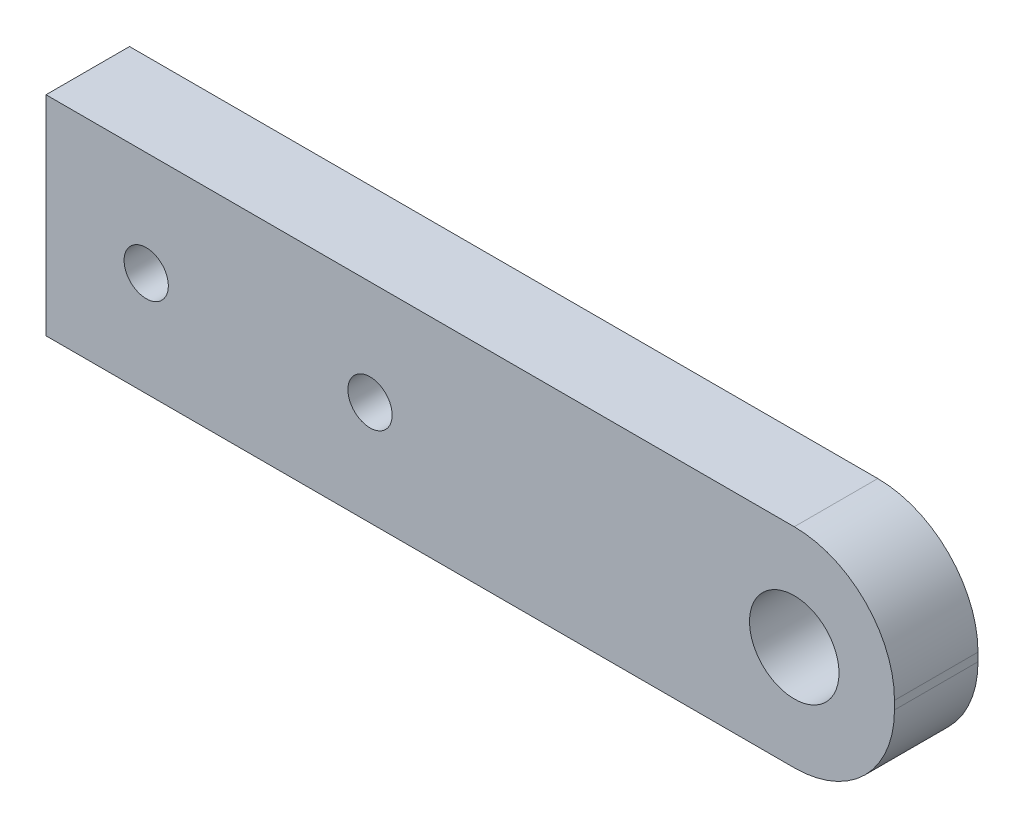
ISO-10303-21;
HEADER;
FILE_DESCRIPTION(('STEP AP214'),'2;1');
FILE_NAME('part.step','',(''),(''),'','','');
FILE_SCHEMA(('AUTOMOTIVE_DESIGN { 1 0 10303 214 1 1 1 1 }'));
ENDSEC;
DATA;
#1=APPLICATION_CONTEXT('core data for automotive mechanical design processes');
#2=APPLICATION_PROTOCOL_DEFINITION('international standard','automotive_design',2000,#1);
#3=PRODUCT_CONTEXT('',#1,'mechanical');
#4=PRODUCT('Part','Part','',(#3));
#5=PRODUCT_RELATED_PRODUCT_CATEGORY('part','',(#4));
#6=PRODUCT_DEFINITION_FORMATION('','',#4);
#7=PRODUCT_DEFINITION_CONTEXT('part definition',#1,'design');
#8=PRODUCT_DEFINITION('design','',#6,#7);
#9=PRODUCT_DEFINITION_SHAPE('','',#8);
#10=(LENGTH_UNIT() NAMED_UNIT(*) SI_UNIT(.MILLI.,.METRE.));
#11=(NAMED_UNIT(*) PLANE_ANGLE_UNIT() SI_UNIT($,.RADIAN.));
#12=(NAMED_UNIT(*) SI_UNIT($,.STERADIAN.) SOLID_ANGLE_UNIT());
#13=UNCERTAINTY_MEASURE_WITH_UNIT(LENGTH_MEASURE(1.E-05),#10,'distance_accuracy_value','');
#14=(GEOMETRIC_REPRESENTATION_CONTEXT(3) GLOBAL_UNCERTAINTY_ASSIGNED_CONTEXT((#13)) GLOBAL_UNIT_ASSIGNED_CONTEXT((#10,
#11,#12)) REPRESENTATION_CONTEXT('',''));
#15=CARTESIAN_POINT('',(0.,0.,0.));
#16=DIRECTION('',(0.,0.,1.));
#17=DIRECTION('',(1.,0.,0.));
#18=AXIS2_PLACEMENT_3D('',#15,#16,#17);
#19=CARTESIAN_POINT('',(0.,0.,10.));
#20=DIRECTION('',(0.,0.,-1.));
#21=DIRECTION('',(-1.,0.,0.));
#22=AXIS2_PLACEMENT_3D('',#19,#20,#21);
#23=PLANE('',#22);
#24=DIRECTION('',(1.,0.,0.));
#25=VECTOR('',#24,1.);
#26=CARTESIAN_POINT('',(114.3,-12.5,10.));
#27=LINE('',#26,#25);
#28=CARTESIAN_POINT('',(12.7,-12.5,10.));
#29=VERTEX_POINT('',#28);
#30=CARTESIAN_POINT('',(102.3,-12.5,10.));
#31=VERTEX_POINT('',#30);
#32=EDGE_CURVE('E93',#29,#31,#27,.T.);
#33=ORIENTED_EDGE('',*,*,#32,.T.);
#34=CARTESIAN_POINT('',(102.3,-0.499999999999988,10.));
#35=DIRECTION('',(0.,0.,-1.));
#36=DIRECTION('',(-1.,0.,0.));
#37=AXIS2_PLACEMENT_3D('',#34,#35,#36);
#38=CIRCLE('',#37,12.);
#39=CARTESIAN_POINT('',(114.3,-0.499999999999985,10.));
#40=VERTEX_POINT('',#39);
#41=EDGE_CURVE('E48',#31,#40,#38,.F.);
#42=ORIENTED_EDGE('',*,*,#41,.T.);
#43=DIRECTION('',(0.,1.,0.));
#44=VECTOR('',#43,1.);
#45=CARTESIAN_POINT('',(114.3,12.5,10.));
#46=LINE('',#45,#44);
#47=CARTESIAN_POINT('',(114.3,0.500000000000013,10.));
#48=VERTEX_POINT('',#47);
#49=EDGE_CURVE('E101',#40,#48,#46,.T.);
#50=ORIENTED_EDGE('',*,*,#49,.T.);
#51=CARTESIAN_POINT('',(102.3,0.500000000000009,10.));
#52=DIRECTION('',(0.,0.,-1.));
#53=DIRECTION('',(-1.,0.,0.));
#54=AXIS2_PLACEMENT_3D('',#51,#52,#53);
#55=CIRCLE('',#54,12.);
#56=CARTESIAN_POINT('',(102.3,12.5,10.));
#57=VERTEX_POINT('',#56);
#58=EDGE_CURVE('E55',#48,#57,#55,.F.);
#59=ORIENTED_EDGE('',*,*,#58,.T.);
#60=DIRECTION('',(-1.,0.,0.));
#61=VECTOR('',#60,1.);
#62=CARTESIAN_POINT('',(114.3,12.5,10.));
#63=LINE('',#62,#61);
#64=CARTESIAN_POINT('',(12.7,12.5,10.));
#65=VERTEX_POINT('',#64);
#66=EDGE_CURVE('E106',#57,#65,#63,.T.);
#67=ORIENTED_EDGE('',*,*,#66,.T.);
#68=DIRECTION('',(0.,-1.,0.));
#69=VECTOR('',#68,1.);
#70=CARTESIAN_POINT('',(12.7,12.5,10.));
#71=LINE('',#70,#69);
#72=EDGE_CURVE('E102',#65,#29,#71,.T.);
#73=ORIENTED_EDGE('',*,*,#72,.T.);
#74=EDGE_LOOP('',(#33,#42,#50,#59,#67,#73));
#75=FACE_BOUND('',#74,.T.);
#76=CARTESIAN_POINT('',(102.3,0.,10.));
#77=DIRECTION('',(0.,0.,1.));
#78=DIRECTION('',(1.,0.,0.));
#79=AXIS2_PLACEMENT_3D('',#76,#77,#78);
#80=CIRCLE('',#79,5.3578125);
#81=CARTESIAN_POINT('',(107.6578125,0.,10.));
#82=VERTEX_POINT('',#81);
#83=EDGE_CURVE('E151',#82,#82,#80,.T.);
#84=ORIENTED_EDGE('',*,*,#83,.F.);
#85=EDGE_LOOP('',(#84));
#86=FACE_BOUND('',#85,.T.);
#87=CARTESIAN_POINT('',(24.7,0.,10.));
#88=DIRECTION('',(0.,0.,1.));
#89=DIRECTION('',(1.,0.,0.));
#90=AXIS2_PLACEMENT_3D('',#87,#88,#89);
#91=CIRCLE('',#90,2.65);
#92=CARTESIAN_POINT('',(27.35,0.,10.));
#93=VERTEX_POINT('',#92);
#94=EDGE_CURVE('E265',#93,#93,#91,.T.);
#95=ORIENTED_EDGE('',*,*,#94,.F.);
#96=EDGE_LOOP('',(#95));
#97=FACE_BOUND('',#96,.T.);
#98=CARTESIAN_POINT('',(51.5,0.,10.));
#99=DIRECTION('',(0.,0.,1.));
#100=DIRECTION('',(1.,0.,0.));
#101=AXIS2_PLACEMENT_3D('',#98,#99,#100);
#102=CIRCLE('',#101,2.65);
#103=CARTESIAN_POINT('',(54.15,0.,10.));
#104=VERTEX_POINT('',#103);
#105=EDGE_CURVE('E255',#104,#104,#102,.T.);
#106=ORIENTED_EDGE('',*,*,#105,.F.);
#107=EDGE_LOOP('',(#106));
#108=FACE_BOUND('',#107,.T.);
#109=ADVANCED_FACE('F40',(#75,#86,#97,#108),#23,.F.);
#110=CARTESIAN_POINT('',(0.,0.,0.));
#111=DIRECTION('',(0.,0.,-1.));
#112=DIRECTION('',(-1.,0.,0.));
#113=AXIS2_PLACEMENT_3D('',#110,#111,#112);
#114=PLANE('',#113);
#115=CARTESIAN_POINT('',(24.7,0.,0.));
#116=DIRECTION('',(0.,0.,1.));
#117=DIRECTION('',(1.,0.,0.));
#118=AXIS2_PLACEMENT_3D('',#115,#116,#117);
#119=CIRCLE('',#118,2.65);
#120=CARTESIAN_POINT('',(27.35,0.,0.));
#121=VERTEX_POINT('',#120);
#122=EDGE_CURVE('E262',#121,#121,#119,.T.);
#123=ORIENTED_EDGE('',*,*,#122,.T.);
#124=EDGE_LOOP('',(#123));
#125=FACE_BOUND('',#124,.T.);
#126=DIRECTION('',(0.,1.,0.));
#127=VECTOR('',#126,1.);
#128=CARTESIAN_POINT('',(114.3,12.5,0.));
#129=LINE('',#128,#127);
#130=CARTESIAN_POINT('',(114.3,-0.499999999999985,0.));
#131=VERTEX_POINT('',#130);
#132=CARTESIAN_POINT('',(114.3,0.500000000000013,0.));
#133=VERTEX_POINT('',#132);
#134=EDGE_CURVE('E148',#131,#133,#129,.T.);
#135=ORIENTED_EDGE('',*,*,#134,.F.);
#136=CARTESIAN_POINT('',(102.3,-0.499999999999988,0.));
#137=DIRECTION('',(0.,0.,-1.));
#138=DIRECTION('',(-1.,0.,0.));
#139=AXIS2_PLACEMENT_3D('',#136,#137,#138);
#140=CIRCLE('',#139,12.);
#141=CARTESIAN_POINT('',(102.3,-12.5,0.));
#142=VERTEX_POINT('',#141);
#143=EDGE_CURVE('E128',#131,#142,#140,.T.);
#144=ORIENTED_EDGE('',*,*,#143,.T.);
#145=DIRECTION('',(1.,0.,0.));
#146=VECTOR('',#145,1.);
#147=CARTESIAN_POINT('',(114.3,-12.5,0.));
#148=LINE('',#147,#146);
#149=CARTESIAN_POINT('',(12.7,-12.5,0.));
#150=VERTEX_POINT('',#149);
#151=EDGE_CURVE('E147',#150,#142,#148,.T.);
#152=ORIENTED_EDGE('',*,*,#151,.F.);
#153=DIRECTION('',(0.,-1.,0.));
#154=VECTOR('',#153,1.);
#155=CARTESIAN_POINT('',(12.7,12.5,0.));
#156=LINE('',#155,#154);
#157=CARTESIAN_POINT('',(12.7,12.5,0.));
#158=VERTEX_POINT('',#157);
#159=EDGE_CURVE('E115',#158,#150,#156,.T.);
#160=ORIENTED_EDGE('',*,*,#159,.F.);
#161=DIRECTION('',(-1.,0.,0.));
#162=VECTOR('',#161,1.);
#163=CARTESIAN_POINT('',(114.3,12.5,0.));
#164=LINE('',#163,#162);
#165=CARTESIAN_POINT('',(102.3,12.5,0.));
#166=VERTEX_POINT('',#165);
#167=EDGE_CURVE('E111',#166,#158,#164,.T.);
#168=ORIENTED_EDGE('',*,*,#167,.F.);
#169=CARTESIAN_POINT('',(102.3,0.500000000000009,0.));
#170=DIRECTION('',(0.,0.,-1.));
#171=DIRECTION('',(-1.,0.,0.));
#172=AXIS2_PLACEMENT_3D('',#169,#170,#171);
#173=CIRCLE('',#172,12.);
#174=EDGE_CURVE('E126',#166,#133,#173,.T.);
#175=ORIENTED_EDGE('',*,*,#174,.T.);
#176=EDGE_LOOP('',(#135,#144,#152,#160,#168,#175));
#177=FACE_BOUND('',#176,.T.);
#178=CARTESIAN_POINT('',(102.3,0.,0.));
#179=DIRECTION('',(0.,0.,1.));
#180=DIRECTION('',(1.,0.,0.));
#181=AXIS2_PLACEMENT_3D('',#178,#179,#180);
#182=CIRCLE('',#181,5.3578125);
#183=CARTESIAN_POINT('',(107.6578125,0.,0.));
#184=VERTEX_POINT('',#183);
#185=EDGE_CURVE('E270',#184,#184,#182,.T.);
#186=ORIENTED_EDGE('',*,*,#185,.T.);
#187=EDGE_LOOP('',(#186));
#188=FACE_BOUND('',#187,.T.);
#189=CARTESIAN_POINT('',(51.5,0.,0.));
#190=DIRECTION('',(0.,0.,1.));
#191=DIRECTION('',(1.,0.,0.));
#192=AXIS2_PLACEMENT_3D('',#189,#190,#191);
#193=CIRCLE('',#192,2.65);
#194=CARTESIAN_POINT('',(54.15,0.,0.));
#195=VERTEX_POINT('',#194);
#196=EDGE_CURVE('E258',#195,#195,#193,.T.);
#197=ORIENTED_EDGE('',*,*,#196,.T.);
#198=EDGE_LOOP('',(#197));
#199=FACE_BOUND('',#198,.T.);
#200=ADVANCED_FACE('F145',(#125,#177,#188,#199),#114,.T.);
#201=CARTESIAN_POINT('',(12.7,12.5,10.));
#202=DIRECTION('',(1.,0.,0.));
#203=DIRECTION('',(0.,1.,0.));
#204=AXIS2_PLACEMENT_3D('',#201,#202,#203);
#205=PLANE('',#204);
#206=ORIENTED_EDGE('',*,*,#159,.T.);
#207=DIRECTION('',(0.,0.,-1.));
#208=VECTOR('',#207,1.);
#209=CARTESIAN_POINT('',(12.7,-12.5,10.));
#210=LINE('',#209,#208);
#211=EDGE_CURVE('E97',#29,#150,#210,.T.);
#212=ORIENTED_EDGE('',*,*,#211,.F.);
#213=ORIENTED_EDGE('',*,*,#72,.F.);
#214=DIRECTION('',(0.,0.,-1.));
#215=VECTOR('',#214,1.);
#216=CARTESIAN_POINT('',(12.7,12.5,10.));
#217=LINE('',#216,#215);
#218=EDGE_CURVE('E117',#65,#158,#217,.T.);
#219=ORIENTED_EDGE('',*,*,#218,.T.);
#220=EDGE_LOOP('',(#206,#212,#213,#219));
#221=FACE_BOUND('',#220,.T.);
#222=ADVANCED_FACE('F113',(#221),#205,.F.);
#223=CARTESIAN_POINT('',(114.3,-12.5,10.));
#224=DIRECTION('',(0.,1.,0.));
#225=DIRECTION('',(-1.,0.,0.));
#226=AXIS2_PLACEMENT_3D('',#223,#224,#225);
#227=PLANE('',#226);
#228=ORIENTED_EDGE('',*,*,#151,.T.);
#229=DIRECTION('',(0.,0.,-1.));
#230=VECTOR('',#229,1.);
#231=CARTESIAN_POINT('',(102.3,-12.5,10.));
#232=LINE('',#231,#230);
#233=EDGE_CURVE('E63',#142,#31,#232,.F.);
#234=ORIENTED_EDGE('',*,*,#233,.T.);
#235=ORIENTED_EDGE('',*,*,#32,.F.);
#236=ORIENTED_EDGE('',*,*,#211,.T.);
#237=EDGE_LOOP('',(#228,#234,#235,#236));
#238=FACE_BOUND('',#237,.T.);
#239=ADVANCED_FACE('F95',(#238),#227,.F.);
#240=CARTESIAN_POINT('',(114.3,12.5,10.));
#241=DIRECTION('',(-1.,0.,0.));
#242=DIRECTION('',(0.,0.,1.));
#243=AXIS2_PLACEMENT_3D('',#240,#241,#242);
#244=PLANE('',#243);
#245=ORIENTED_EDGE('',*,*,#49,.F.);
#246=DIRECTION('',(0.,0.,-1.));
#247=VECTOR('',#246,1.);
#248=CARTESIAN_POINT('',(114.3,-0.499999999999988,10.));
#249=LINE('',#248,#247);
#250=EDGE_CURVE('E119',#40,#131,#249,.T.);
#251=ORIENTED_EDGE('',*,*,#250,.T.);
#252=ORIENTED_EDGE('',*,*,#134,.T.);
#253=DIRECTION('',(0.,0.,-1.));
#254=VECTOR('',#253,1.);
#255=CARTESIAN_POINT('',(114.3,0.500000000000009,10.));
#256=LINE('',#255,#254);
#257=EDGE_CURVE('E116',#133,#48,#256,.F.);
#258=ORIENTED_EDGE('',*,*,#257,.T.);
#259=EDGE_LOOP('',(#245,#251,#252,#258));
#260=FACE_BOUND('',#259,.T.);
#261=ADVANCED_FACE('F138',(#260),#244,.F.);
#262=CARTESIAN_POINT('',(114.3,12.5,10.));
#263=DIRECTION('',(0.,-1.,0.));
#264=DIRECTION('',(1.,0.,0.));
#265=AXIS2_PLACEMENT_3D('',#262,#263,#264);
#266=PLANE('',#265);
#267=ORIENTED_EDGE('',*,*,#66,.F.);
#268=DIRECTION('',(0.,0.,-1.));
#269=VECTOR('',#268,1.);
#270=CARTESIAN_POINT('',(102.3,12.5,10.));
#271=LINE('',#270,#269);
#272=EDGE_CURVE('E12',#57,#166,#271,.T.);
#273=ORIENTED_EDGE('',*,*,#272,.T.);
#274=ORIENTED_EDGE('',*,*,#167,.T.);
#275=ORIENTED_EDGE('',*,*,#218,.F.);
#276=EDGE_LOOP('',(#267,#273,#274,#275));
#277=FACE_BOUND('',#276,.T.);
#278=ADVANCED_FACE('F156',(#277),#266,.F.);
#279=CARTESIAN_POINT('',(102.3,0.,10.));
#280=DIRECTION('',(0.,0.,-1.));
#281=DIRECTION('',(-1.,0.,0.));
#282=AXIS2_PLACEMENT_3D('',#279,#280,#281);
#283=CYLINDRICAL_SURFACE('',#282,5.3578125);
#284=ORIENTED_EDGE('',*,*,#83,.T.);
#285=EDGE_LOOP('',(#284));
#286=FACE_BOUND('',#285,.T.);
#287=ORIENTED_EDGE('',*,*,#185,.F.);
#288=EDGE_LOOP('',(#287));
#289=FACE_BOUND('',#288,.T.);
#290=ADVANCED_FACE('F172',(#286,#289),#283,.F.);
#291=CARTESIAN_POINT('',(24.7,0.,10.));
#292=DIRECTION('',(0.,0.,-1.));
#293=DIRECTION('',(-1.,0.,0.));
#294=AXIS2_PLACEMENT_3D('',#291,#292,#293);
#295=CYLINDRICAL_SURFACE('',#294,2.65);
#296=ORIENTED_EDGE('',*,*,#94,.T.);
#297=EDGE_LOOP('',(#296));
#298=FACE_BOUND('',#297,.T.);
#299=ORIENTED_EDGE('',*,*,#122,.F.);
#300=EDGE_LOOP('',(#299));
#301=FACE_BOUND('',#300,.T.);
#302=ADVANCED_FACE('F205',(#298,#301),#295,.F.);
#303=CARTESIAN_POINT('',(51.5,0.,10.));
#304=DIRECTION('',(0.,0.,-1.));
#305=DIRECTION('',(-1.,0.,0.));
#306=AXIS2_PLACEMENT_3D('',#303,#304,#305);
#307=CYLINDRICAL_SURFACE('',#306,2.65);
#308=ORIENTED_EDGE('',*,*,#105,.T.);
#309=EDGE_LOOP('',(#308));
#310=FACE_BOUND('',#309,.T.);
#311=ORIENTED_EDGE('',*,*,#196,.F.);
#312=EDGE_LOOP('',(#311));
#313=FACE_BOUND('',#312,.T.);
#314=ADVANCED_FACE('F163',(#310,#313),#307,.F.);
#315=CARTESIAN_POINT('',(102.3,-0.499999999999988,10.));
#316=DIRECTION('',(0.,0.,-1.));
#317=DIRECTION('',(-1.,0.,0.));
#318=AXIS2_PLACEMENT_3D('',#315,#316,#317);
#319=CYLINDRICAL_SURFACE('',#318,12.);
#320=ORIENTED_EDGE('',*,*,#41,.F.);
#321=ORIENTED_EDGE('',*,*,#233,.F.);
#322=ORIENTED_EDGE('',*,*,#143,.F.);
#323=ORIENTED_EDGE('',*,*,#250,.F.);
#324=EDGE_LOOP('',(#320,#321,#322,#323));
#325=FACE_BOUND('',#324,.T.);
#326=ADVANCED_FACE('F143',(#325),#319,.T.);
#327=CARTESIAN_POINT('',(102.3,0.500000000000009,10.));
#328=DIRECTION('',(0.,0.,-1.));
#329=DIRECTION('',(-1.,0.,0.));
#330=AXIS2_PLACEMENT_3D('',#327,#328,#329);
#331=CYLINDRICAL_SURFACE('',#330,12.);
#332=ORIENTED_EDGE('',*,*,#58,.F.);
#333=ORIENTED_EDGE('',*,*,#257,.F.);
#334=ORIENTED_EDGE('',*,*,#174,.F.);
#335=ORIENTED_EDGE('',*,*,#272,.F.);
#336=EDGE_LOOP('',(#332,#333,#334,#335));
#337=FACE_BOUND('',#336,.T.);
#338=ADVANCED_FACE('F42',(#337),#331,.T.);
#339=CLOSED_SHELL('',(#109,#200,#222,#239,#261,#278,#290,#302,#314,#326,#338));
#340=MANIFOLD_SOLID_BREP('B2',#339);
#341=ADVANCED_BREP_SHAPE_REPRESENTATION('',(#18,#340),#14);
#342=SHAPE_DEFINITION_REPRESENTATION(#9,#341);
ENDSEC;
END-ISO-10303-21;
